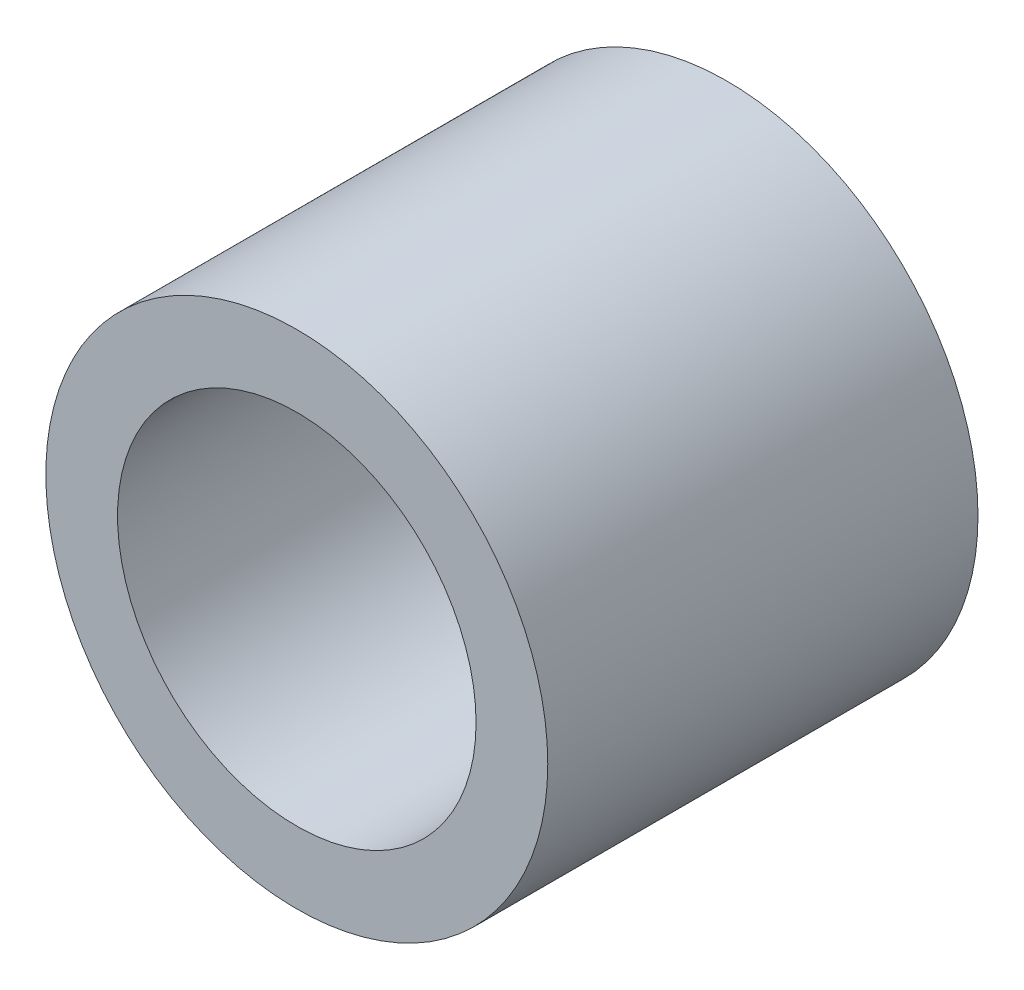
ISO-10303-21;
HEADER;
FILE_DESCRIPTION(('STEP AP214'),'2;1');
FILE_NAME('part.step','',(''),(''),'','','');
FILE_SCHEMA(('AUTOMOTIVE_DESIGN { 1 0 10303 214 1 1 1 1 }'));
ENDSEC;
DATA;
#1=APPLICATION_CONTEXT('core data for automotive mechanical design processes');
#2=APPLICATION_PROTOCOL_DEFINITION('international standard','automotive_design',2000,#1);
#3=PRODUCT_CONTEXT('',#1,'mechanical');
#4=PRODUCT('Part','Part','',(#3));
#5=PRODUCT_RELATED_PRODUCT_CATEGORY('part','',(#4));
#6=PRODUCT_DEFINITION_FORMATION('','',#4);
#7=PRODUCT_DEFINITION_CONTEXT('part definition',#1,'design');
#8=PRODUCT_DEFINITION('design','',#6,#7);
#9=PRODUCT_DEFINITION_SHAPE('','',#8);
#10=(LENGTH_UNIT() NAMED_UNIT(*) SI_UNIT(.MILLI.,.METRE.));
#11=(NAMED_UNIT(*) PLANE_ANGLE_UNIT() SI_UNIT($,.RADIAN.));
#12=(NAMED_UNIT(*) SI_UNIT($,.STERADIAN.) SOLID_ANGLE_UNIT());
#13=UNCERTAINTY_MEASURE_WITH_UNIT(LENGTH_MEASURE(1.E-05),#10,'distance_accuracy_value','');
#14=(GEOMETRIC_REPRESENTATION_CONTEXT(3) GLOBAL_UNCERTAINTY_ASSIGNED_CONTEXT((#13)) GLOBAL_UNIT_ASSIGNED_CONTEXT((#10,
#11,#12)) REPRESENTATION_CONTEXT('',''));
#15=CARTESIAN_POINT('',(0.,0.,0.));
#16=DIRECTION('',(0.,0.,1.));
#17=DIRECTION('',(1.,0.,0.));
#18=AXIS2_PLACEMENT_3D('',#15,#16,#17);
#19=CARTESIAN_POINT('',(0.,0.,12.));
#20=DIRECTION('',(0.,0.,1.));
#21=DIRECTION('',(1.,0.,0.));
#22=AXIS2_PLACEMENT_3D('',#19,#20,#21);
#23=PLANE('',#22);
#24=CARTESIAN_POINT('',(0.,0.,12.));
#25=DIRECTION('',(0.,0.,1.));
#26=DIRECTION('',(1.,0.,0.));
#27=AXIS2_PLACEMENT_3D('',#24,#25,#26);
#28=CIRCLE('',#27,7.);
#29=CARTESIAN_POINT('',(7.,0.,12.));
#30=VERTEX_POINT('',#29);
#31=EDGE_CURVE('E10',#30,#30,#28,.T.);
#32=ORIENTED_EDGE('',*,*,#31,.T.);
#33=EDGE_LOOP('',(#32));
#34=FACE_BOUND('',#33,.T.);
#35=CARTESIAN_POINT('',(0.,0.,12.));
#36=DIRECTION('',(0.,0.,1.));
#37=DIRECTION('',(1.,0.,0.));
#38=AXIS2_PLACEMENT_3D('',#35,#36,#37);
#39=CIRCLE('',#38,5.);
#40=CARTESIAN_POINT('',(5.,0.,12.));
#41=VERTEX_POINT('',#40);
#42=EDGE_CURVE('E50',#41,#41,#39,.T.);
#43=ORIENTED_EDGE('',*,*,#42,.F.);
#44=EDGE_LOOP('',(#43));
#45=FACE_BOUND('',#44,.T.);
#46=ADVANCED_FACE('F39',(#34,#45),#23,.T.);
#47=CARTESIAN_POINT('',(0.,0.,0.));
#48=DIRECTION('',(0.,0.,1.));
#49=DIRECTION('',(1.,0.,0.));
#50=AXIS2_PLACEMENT_3D('',#47,#48,#49);
#51=PLANE('',#50);
#52=CARTESIAN_POINT('',(0.,0.,0.));
#53=DIRECTION('',(0.,0.,1.));
#54=DIRECTION('',(1.,0.,0.));
#55=AXIS2_PLACEMENT_3D('',#52,#53,#54);
#56=CIRCLE('',#55,7.);
#57=CARTESIAN_POINT('',(7.,0.,0.));
#58=VERTEX_POINT('',#57);
#59=EDGE_CURVE('E43',#58,#58,#56,.T.);
#60=ORIENTED_EDGE('',*,*,#59,.F.);
#61=EDGE_LOOP('',(#60));
#62=FACE_BOUND('',#61,.T.);
#63=CARTESIAN_POINT('',(0.,0.,0.));
#64=DIRECTION('',(0.,0.,1.));
#65=DIRECTION('',(1.,0.,0.));
#66=AXIS2_PLACEMENT_3D('',#63,#64,#65);
#67=CIRCLE('',#66,5.);
#68=CARTESIAN_POINT('',(5.,0.,0.));
#69=VERTEX_POINT('',#68);
#70=EDGE_CURVE('E52',#69,#69,#67,.T.);
#71=ORIENTED_EDGE('',*,*,#70,.T.);
#72=EDGE_LOOP('',(#71));
#73=FACE_BOUND('',#72,.T.);
#74=ADVANCED_FACE('F62',(#62,#73),#51,.F.);
#75=CARTESIAN_POINT('',(0.,0.,12.));
#76=DIRECTION('',(0.,0.,-1.));
#77=DIRECTION('',(-1.,0.,0.));
#78=AXIS2_PLACEMENT_3D('',#75,#76,#77);
#79=CYLINDRICAL_SURFACE('',#78,7.);
#80=ORIENTED_EDGE('',*,*,#31,.F.);
#81=EDGE_LOOP('',(#80));
#82=FACE_BOUND('',#81,.T.);
#83=ORIENTED_EDGE('',*,*,#59,.T.);
#84=EDGE_LOOP('',(#83));
#85=FACE_BOUND('',#84,.T.);
#86=ADVANCED_FACE('F41',(#82,#85),#79,.T.);
#87=CARTESIAN_POINT('',(0.,0.,12.));
#88=DIRECTION('',(0.,0.,-1.));
#89=DIRECTION('',(-1.,0.,0.));
#90=AXIS2_PLACEMENT_3D('',#87,#88,#89);
#91=CYLINDRICAL_SURFACE('',#90,5.);
#92=ORIENTED_EDGE('',*,*,#42,.T.);
#93=EDGE_LOOP('',(#92));
#94=FACE_BOUND('',#93,.T.);
#95=ORIENTED_EDGE('',*,*,#70,.F.);
#96=EDGE_LOOP('',(#95));
#97=FACE_BOUND('',#96,.T.);
#98=ADVANCED_FACE('F58',(#94,#97),#91,.F.);
#99=CLOSED_SHELL('',(#46,#74,#86,#98));
#100=MANIFOLD_SOLID_BREP('B2',#99);
#101=ADVANCED_BREP_SHAPE_REPRESENTATION('',(#18,#100),#14);
#102=SHAPE_DEFINITION_REPRESENTATION(#9,#101);
ENDSEC;
END-ISO-10303-21;
